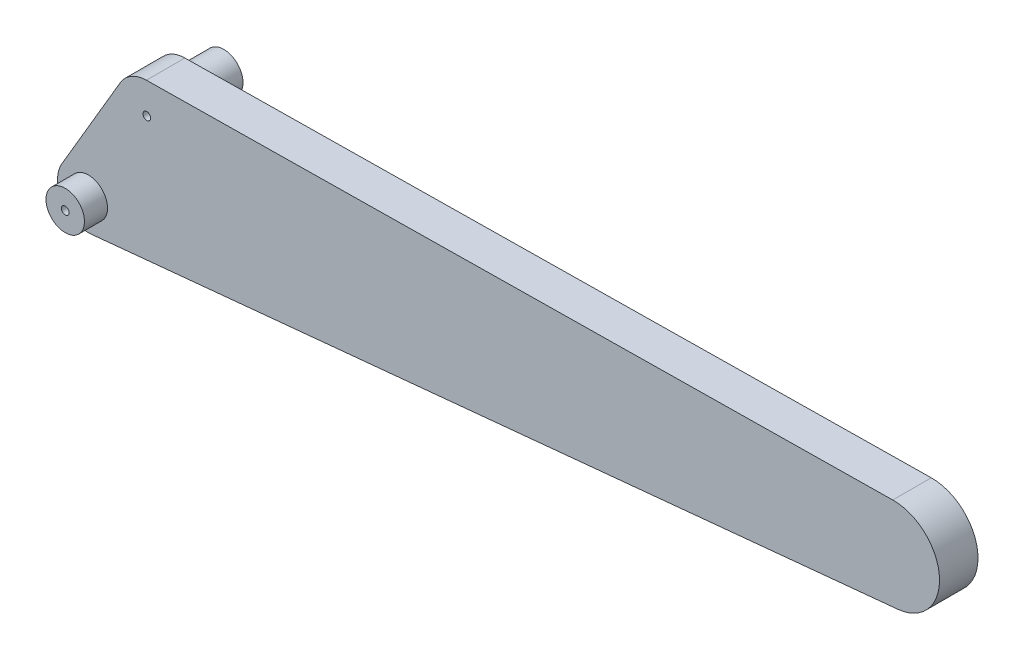
ISO-10303-21;
HEADER;
FILE_DESCRIPTION(('STEP AP214'),'2;1');
FILE_NAME('part.step','',(''),(''),'','','');
FILE_SCHEMA(('AUTOMOTIVE_DESIGN { 1 0 10303 214 1 1 1 1 }'));
ENDSEC;
DATA;
#1=APPLICATION_CONTEXT('core data for automotive mechanical design processes');
#2=APPLICATION_PROTOCOL_DEFINITION('international standard','automotive_design',2000,#1);
#3=PRODUCT_CONTEXT('',#1,'mechanical');
#4=PRODUCT('Part','Part','',(#3));
#5=PRODUCT_RELATED_PRODUCT_CATEGORY('part','',(#4));
#6=PRODUCT_DEFINITION_FORMATION('','',#4);
#7=PRODUCT_DEFINITION_CONTEXT('part definition',#1,'design');
#8=PRODUCT_DEFINITION('design','',#6,#7);
#9=PRODUCT_DEFINITION_SHAPE('','',#8);
#10=(LENGTH_UNIT() NAMED_UNIT(*) SI_UNIT(.MILLI.,.METRE.));
#11=(NAMED_UNIT(*) PLANE_ANGLE_UNIT() SI_UNIT($,.RADIAN.));
#12=(NAMED_UNIT(*) SI_UNIT($,.STERADIAN.) SOLID_ANGLE_UNIT());
#13=UNCERTAINTY_MEASURE_WITH_UNIT(LENGTH_MEASURE(1.E-05),#10,'distance_accuracy_value','');
#14=(GEOMETRIC_REPRESENTATION_CONTEXT(3) GLOBAL_UNCERTAINTY_ASSIGNED_CONTEXT((#13)) GLOBAL_UNIT_ASSIGNED_CONTEXT((#10,
#11,#12)) REPRESENTATION_CONTEXT('',''));
#15=CARTESIAN_POINT('',(0.,0.,0.));
#16=DIRECTION('',(0.,0.,1.));
#17=DIRECTION('',(1.,0.,0.));
#18=AXIS2_PLACEMENT_3D('',#15,#16,#17);
#19=CARTESIAN_POINT('',(0.,0.,5.));
#20=DIRECTION('',(0.,0.,1.));
#21=DIRECTION('',(1.,0.,0.));
#22=AXIS2_PLACEMENT_3D('',#19,#20,#21);
#23=PLANE('',#22);
#24=CARTESIAN_POINT('',(-7.59978648113398,-12.9322560074093,5.));
#25=DIRECTION('',(0.,0.,1.));
#26=DIRECTION('',(1.,0.,0.));
#27=AXIS2_PLACEMENT_3D('',#24,#25,#26);
#28=CIRCLE('',#27,2.5);
#29=CARTESIAN_POINT('',(-5.09978648113398,-12.9322560074093,5.));
#30=VERTEX_POINT('',#29);
#31=EDGE_CURVE('E134',#30,#30,#28,.T.);
#32=ORIENTED_EDGE('',*,*,#31,.F.);
#33=EDGE_LOOP('',(#32));
#34=FACE_BOUND('',#33,.T.);
#35=CARTESIAN_POINT('',(0.,0.,5.));
#36=DIRECTION('',(0.,0.,1.));
#37=DIRECTION('',(1.,0.,0.));
#38=AXIS2_PLACEMENT_3D('',#35,#36,#37);
#39=CIRCLE('',#38,4.);
#40=CARTESIAN_POINT('',(-0.0516811774149059,3.99966611805298,5.));
#41=VERTEX_POINT('',#40);
#42=CARTESIAN_POINT('',(-3.4486016019758,2.02660972830239,5.));
#43=VERTEX_POINT('',#42);
#44=EDGE_CURVE('E146',#41,#43,#39,.T.);
#45=ORIENTED_EDGE('',*,*,#44,.T.);
#46=DIRECTION('',(-0.506652432075599,-0.862150400493951,0.));
#47=VECTOR('',#46,1.);
#48=CARTESIAN_POINT('',(-11.0483880831098,-10.9056462791069,5.));
#49=LINE('',#48,#47);
#50=CARTESIAN_POINT('',(-11.0483880831098,-10.9056462791069,5.));
#51=VERTEX_POINT('',#50);
#52=EDGE_CURVE('E94',#43,#51,#49,.T.);
#53=ORIENTED_EDGE('',*,*,#52,.T.);
#54=CARTESIAN_POINT('',(-7.59978648113398,-12.9322560074093,5.));
#55=DIRECTION('',(0.,0.,1.));
#56=DIRECTION('',(1.,0.,0.));
#57=AXIS2_PLACEMENT_3D('',#54,#55,#56);
#58=CIRCLE('',#57,4.);
#59=CARTESIAN_POINT('',(-7.21247386893879,-16.9134604659161,5.));
#60=VERTEX_POINT('',#59);
#61=EDGE_CURVE('E107',#51,#60,#58,.T.);
#62=ORIENTED_EDGE('',*,*,#61,.T.);
#63=DIRECTION('',(0.995301114626704,0.0968281530487968,0.));
#64=VECTOR('',#63,1.);
#65=CARTESIAN_POINT('',(97.5809689182928,-6.71860047068932,5.));
#66=LINE('',#65,#64);
#67=CARTESIAN_POINT('',(97.5809689182928,-6.71860047068932,5.));
#68=VERTEX_POINT('',#67);
#69=EDGE_CURVE('E101',#60,#68,#66,.T.);
#70=ORIENTED_EDGE('',*,*,#69,.T.);
#71=CARTESIAN_POINT('',(97.,-0.746793782929099,5.));
#72=DIRECTION('',(0.,0.,1.));
#73=DIRECTION('',(1.,0.,0.));
#74=AXIS2_PLACEMENT_3D('',#71,#72,#73);
#75=CIRCLE('',#74,6.);
#76=CARTESIAN_POINT('',(96.9224782338776,5.25270539415037,5.));
#77=VERTEX_POINT('',#76);
#78=EDGE_CURVE('E105',#68,#77,#75,.T.);
#79=ORIENTED_EDGE('',*,*,#78,.T.);
#80=DIRECTION('',(-0.999916529513246,-0.0129202943537264,0.));
#81=VECTOR('',#80,1.);
#82=CARTESIAN_POINT('',(-0.0516811774149059,3.99966611805298,5.));
#83=LINE('',#82,#81);
#84=EDGE_CURVE('E57',#77,#41,#83,.T.);
#85=ORIENTED_EDGE('',*,*,#84,.T.);
#86=EDGE_LOOP('',(#45,#53,#62,#70,#79,#85));
#87=FACE_BOUND('',#86,.T.);
#88=CARTESIAN_POINT('',(0.,0.,5.));
#89=DIRECTION('',(0.,0.,1.));
#90=DIRECTION('',(1.,0.,0.));
#91=AXIS2_PLACEMENT_3D('',#88,#89,#90);
#92=CIRCLE('',#91,0.5);
#93=CARTESIAN_POINT('',(0.5,0.,5.));
#94=VERTEX_POINT('',#93);
#95=EDGE_CURVE('E222',#94,#94,#92,.T.);
#96=ORIENTED_EDGE('',*,*,#95,.F.);
#97=EDGE_LOOP('',(#96));
#98=FACE_BOUND('',#97,.T.);
#99=ADVANCED_FACE('F39',(#34,#87,#98),#23,.T.);
#100=CARTESIAN_POINT('',(0.,0.,0.));
#101=DIRECTION('',(0.,0.,1.));
#102=DIRECTION('',(1.,0.,0.));
#103=AXIS2_PLACEMENT_3D('',#100,#101,#102);
#104=PLANE('',#103);
#105=CARTESIAN_POINT('',(0.,0.,0.));
#106=DIRECTION('',(0.,0.,1.));
#107=DIRECTION('',(1.,0.,0.));
#108=AXIS2_PLACEMENT_3D('',#105,#106,#107);
#109=CIRCLE('',#108,4.);
#110=CARTESIAN_POINT('',(-0.0516811774149059,3.99966611805298,0.));
#111=VERTEX_POINT('',#110);
#112=CARTESIAN_POINT('',(-3.4486016019758,2.02660972830239,0.));
#113=VERTEX_POINT('',#112);
#114=EDGE_CURVE('E129',#111,#113,#109,.T.);
#115=ORIENTED_EDGE('',*,*,#114,.F.);
#116=DIRECTION('',(-0.999916529513246,-0.0129202943537264,0.));
#117=VECTOR('',#116,1.);
#118=CARTESIAN_POINT('',(-0.0516811774149059,3.99966611805298,0.));
#119=LINE('',#118,#117);
#120=CARTESIAN_POINT('',(96.9224782338776,5.25270539415037,0.));
#121=VERTEX_POINT('',#120);
#122=EDGE_CURVE('E86',#121,#111,#119,.T.);
#123=ORIENTED_EDGE('',*,*,#122,.F.);
#124=CARTESIAN_POINT('',(97.,-0.746793782929099,0.));
#125=DIRECTION('',(0.,0.,1.));
#126=DIRECTION('',(1.,0.,0.));
#127=AXIS2_PLACEMENT_3D('',#124,#125,#126);
#128=CIRCLE('',#127,6.);
#129=CARTESIAN_POINT('',(97.5809689182928,-6.71860047068932,0.));
#130=VERTEX_POINT('',#129);
#131=EDGE_CURVE('E80',#130,#121,#128,.T.);
#132=ORIENTED_EDGE('',*,*,#131,.F.);
#133=DIRECTION('',(0.995301114626704,0.0968281530487968,0.));
#134=VECTOR('',#133,1.);
#135=CARTESIAN_POINT('',(97.5809689182928,-6.71860047068932,0.));
#136=LINE('',#135,#134);
#137=CARTESIAN_POINT('',(-7.21247386893879,-16.9134604659161,0.));
#138=VERTEX_POINT('',#137);
#139=EDGE_CURVE('E116',#138,#130,#136,.T.);
#140=ORIENTED_EDGE('',*,*,#139,.F.);
#141=CARTESIAN_POINT('',(-7.59978648113398,-12.9322560074093,0.));
#142=DIRECTION('',(0.,0.,1.));
#143=DIRECTION('',(1.,0.,0.));
#144=AXIS2_PLACEMENT_3D('',#141,#142,#143);
#145=CIRCLE('',#144,4.);
#146=CARTESIAN_POINT('',(-11.0483880831098,-10.9056462791069,0.));
#147=VERTEX_POINT('',#146);
#148=EDGE_CURVE('E137',#147,#138,#145,.T.);
#149=ORIENTED_EDGE('',*,*,#148,.F.);
#150=DIRECTION('',(-0.506652432075599,-0.862150400493951,0.));
#151=VECTOR('',#150,1.);
#152=CARTESIAN_POINT('',(-11.0483880831098,-10.9056462791069,0.));
#153=LINE('',#152,#151);
#154=EDGE_CURVE('E133',#113,#147,#153,.T.);
#155=ORIENTED_EDGE('',*,*,#154,.F.);
#156=EDGE_LOOP('',(#115,#123,#132,#140,#149,#155));
#157=FACE_BOUND('',#156,.T.);
#158=CARTESIAN_POINT('',(0.,0.,0.));
#159=DIRECTION('',(0.,0.,1.));
#160=DIRECTION('',(1.,0.,0.));
#161=AXIS2_PLACEMENT_3D('',#158,#159,#160);
#162=CIRCLE('',#161,2.5);
#163=CARTESIAN_POINT('',(2.5,0.,0.));
#164=VERTEX_POINT('',#163);
#165=EDGE_CURVE('E234',#164,#164,#162,.T.);
#166=ORIENTED_EDGE('',*,*,#165,.T.);
#167=EDGE_LOOP('',(#166));
#168=FACE_BOUND('',#167,.T.);
#169=CARTESIAN_POINT('',(-7.59978648113398,-12.9322560074093,0.));
#170=DIRECTION('',(0.,0.,-1.));
#171=DIRECTION('',(-1.,0.,0.));
#172=AXIS2_PLACEMENT_3D('',#169,#170,#171);
#173=CIRCLE('',#172,0.500000000000001);
#174=CARTESIAN_POINT('',(-8.09978648113398,-12.9322560074093,0.));
#175=VERTEX_POINT('',#174);
#176=EDGE_CURVE('E211',#175,#175,#173,.T.);
#177=ORIENTED_EDGE('',*,*,#176,.F.);
#178=EDGE_LOOP('',(#177));
#179=FACE_BOUND('',#178,.T.);
#180=ADVANCED_FACE('F159',(#157,#168,#179),#104,.F.);
#181=CARTESIAN_POINT('',(0.,0.,5.));
#182=DIRECTION('',(0.,0.,-1.));
#183=DIRECTION('',(-1.,0.,0.));
#184=AXIS2_PLACEMENT_3D('',#181,#182,#183);
#185=CYLINDRICAL_SURFACE('',#184,4.);
#186=ORIENTED_EDGE('',*,*,#114,.T.);
#187=DIRECTION('',(0.,0.,-1.));
#188=VECTOR('',#187,1.);
#189=CARTESIAN_POINT('',(-3.4486016019758,2.02660972830239,5.));
#190=LINE('',#189,#188);
#191=EDGE_CURVE('E11',#43,#113,#190,.T.);
#192=ORIENTED_EDGE('',*,*,#191,.F.);
#193=ORIENTED_EDGE('',*,*,#44,.F.);
#194=DIRECTION('',(0.,0.,-1.));
#195=VECTOR('',#194,1.);
#196=CARTESIAN_POINT('',(-0.0516811774149059,3.99966611805298,5.));
#197=LINE('',#196,#195);
#198=EDGE_CURVE('E125',#41,#111,#197,.T.);
#199=ORIENTED_EDGE('',*,*,#198,.T.);
#200=EDGE_LOOP('',(#186,#192,#193,#199));
#201=FACE_BOUND('',#200,.T.);
#202=ADVANCED_FACE('F41',(#201),#185,.T.);
#203=CARTESIAN_POINT('',(-11.0483880831098,-10.9056462791069,5.));
#204=DIRECTION('',(0.862150400493951,-0.506652432075599,0.));
#205=DIRECTION('',(0.506652432075599,0.862150400493952,0.));
#206=AXIS2_PLACEMENT_3D('',#203,#204,#205);
#207=PLANE('',#206);
#208=ORIENTED_EDGE('',*,*,#154,.T.);
#209=DIRECTION('',(0.,0.,-1.));
#210=VECTOR('',#209,1.);
#211=CARTESIAN_POINT('',(-11.0483880831098,-10.9056462791069,5.));
#212=LINE('',#211,#210);
#213=EDGE_CURVE('E49',#51,#147,#212,.T.);
#214=ORIENTED_EDGE('',*,*,#213,.F.);
#215=ORIENTED_EDGE('',*,*,#52,.F.);
#216=ORIENTED_EDGE('',*,*,#191,.T.);
#217=EDGE_LOOP('',(#208,#214,#215,#216));
#218=FACE_BOUND('',#217,.T.);
#219=ADVANCED_FACE('F308',(#218),#207,.F.);
#220=CARTESIAN_POINT('',(-7.59978648113398,-12.9322560074093,5.));
#221=DIRECTION('',(0.,0.,-1.));
#222=DIRECTION('',(-1.,0.,0.));
#223=AXIS2_PLACEMENT_3D('',#220,#221,#222);
#224=CYLINDRICAL_SURFACE('',#223,4.);
#225=ORIENTED_EDGE('',*,*,#148,.T.);
#226=DIRECTION('',(0.,0.,-1.));
#227=VECTOR('',#226,1.);
#228=CARTESIAN_POINT('',(-7.21247386893879,-16.9134604659161,5.));
#229=LINE('',#228,#227);
#230=EDGE_CURVE('E118',#60,#138,#229,.T.);
#231=ORIENTED_EDGE('',*,*,#230,.F.);
#232=ORIENTED_EDGE('',*,*,#61,.F.);
#233=ORIENTED_EDGE('',*,*,#213,.T.);
#234=EDGE_LOOP('',(#225,#231,#232,#233));
#235=FACE_BOUND('',#234,.T.);
#236=ADVANCED_FACE('F156',(#235),#224,.T.);
#237=CARTESIAN_POINT('',(97.5809689182928,-6.71860047068932,5.));
#238=DIRECTION('',(-0.0968281530487968,0.995301114626704,0.));
#239=DIRECTION('',(-0.995301114626704,-0.0968281530487968,0.));
#240=AXIS2_PLACEMENT_3D('',#237,#238,#239);
#241=PLANE('',#240);
#242=ORIENTED_EDGE('',*,*,#139,.T.);
#243=DIRECTION('',(0.,0.,-1.));
#244=VECTOR('',#243,1.);
#245=CARTESIAN_POINT('',(97.5809689182928,-6.71860047068932,5.));
#246=LINE('',#245,#244);
#247=EDGE_CURVE('E113',#68,#130,#246,.T.);
#248=ORIENTED_EDGE('',*,*,#247,.F.);
#249=ORIENTED_EDGE('',*,*,#69,.F.);
#250=ORIENTED_EDGE('',*,*,#230,.T.);
#251=EDGE_LOOP('',(#242,#248,#249,#250));
#252=FACE_BOUND('',#251,.T.);
#253=ADVANCED_FACE('F114',(#252),#241,.F.);
#254=CARTESIAN_POINT('',(97.,-0.746793782929099,5.));
#255=DIRECTION('',(0.,0.,-1.));
#256=DIRECTION('',(-1.,0.,0.));
#257=AXIS2_PLACEMENT_3D('',#254,#255,#256);
#258=CYLINDRICAL_SURFACE('',#257,6.);
#259=ORIENTED_EDGE('',*,*,#131,.T.);
#260=DIRECTION('',(0.,0.,-1.));
#261=VECTOR('',#260,1.);
#262=CARTESIAN_POINT('',(96.9224782338776,5.25270539415037,5.));
#263=LINE('',#262,#261);
#264=EDGE_CURVE('E119',#77,#121,#263,.T.);
#265=ORIENTED_EDGE('',*,*,#264,.F.);
#266=ORIENTED_EDGE('',*,*,#78,.F.);
#267=ORIENTED_EDGE('',*,*,#247,.T.);
#268=EDGE_LOOP('',(#259,#265,#266,#267));
#269=FACE_BOUND('',#268,.T.);
#270=ADVANCED_FACE('F121',(#269),#258,.T.);
#271=CARTESIAN_POINT('',(-0.0516811774149059,3.99966611805298,5.));
#272=DIRECTION('',(0.0129202943537264,-0.999916529513245,0.));
#273=DIRECTION('',(0.999916529513246,0.0129202943537264,0.));
#274=AXIS2_PLACEMENT_3D('',#271,#272,#273);
#275=PLANE('',#274);
#276=ORIENTED_EDGE('',*,*,#122,.T.);
#277=ORIENTED_EDGE('',*,*,#198,.F.);
#278=ORIENTED_EDGE('',*,*,#84,.F.);
#279=ORIENTED_EDGE('',*,*,#264,.T.);
#280=EDGE_LOOP('',(#276,#277,#278,#279));
#281=FACE_BOUND('',#280,.T.);
#282=ADVANCED_FACE('F164',(#281),#275,.F.);
#283=CARTESIAN_POINT('',(0.,0.,-5.));
#284=DIRECTION('',(0.,0.,1.));
#285=DIRECTION('',(1.,0.,0.));
#286=AXIS2_PLACEMENT_3D('',#283,#284,#285);
#287=CYLINDRICAL_SURFACE('',#286,2.5);
#288=CARTESIAN_POINT('',(0.,0.,-5.));
#289=DIRECTION('',(0.,0.,1.));
#290=DIRECTION('',(1.,0.,0.));
#291=AXIS2_PLACEMENT_3D('',#288,#289,#290);
#292=CIRCLE('',#291,2.5);
#293=CARTESIAN_POINT('',(2.5,0.,-5.));
#294=VERTEX_POINT('',#293);
#295=EDGE_CURVE('E227',#294,#294,#292,.T.);
#296=ORIENTED_EDGE('',*,*,#295,.T.);
#297=EDGE_LOOP('',(#296));
#298=FACE_BOUND('',#297,.T.);
#299=ORIENTED_EDGE('',*,*,#165,.F.);
#300=EDGE_LOOP('',(#299));
#301=FACE_BOUND('',#300,.T.);
#302=ADVANCED_FACE('F166',(#298,#301),#287,.T.);
#303=CARTESIAN_POINT('',(0.,0.,-5.));
#304=DIRECTION('',(0.,0.,1.));
#305=DIRECTION('',(1.,0.,0.));
#306=AXIS2_PLACEMENT_3D('',#303,#304,#305);
#307=PLANE('',#306);
#308=CARTESIAN_POINT('',(0.,0.,-5.));
#309=DIRECTION('',(0.,0.,1.));
#310=DIRECTION('',(1.,0.,0.));
#311=AXIS2_PLACEMENT_3D('',#308,#309,#310);
#312=CIRCLE('',#311,0.5);
#313=CARTESIAN_POINT('',(0.5,0.,-5.));
#314=VERTEX_POINT('',#313);
#315=EDGE_CURVE('E223',#314,#314,#312,.T.);
#316=ORIENTED_EDGE('',*,*,#315,.T.);
#317=EDGE_LOOP('',(#316));
#318=FACE_BOUND('',#317,.T.);
#319=ORIENTED_EDGE('',*,*,#295,.F.);
#320=EDGE_LOOP('',(#319));
#321=FACE_BOUND('',#320,.T.);
#322=ADVANCED_FACE('F172',(#318,#321),#307,.F.);
#323=CARTESIAN_POINT('',(0.,0.,-5.));
#324=DIRECTION('',(0.,0.,1.));
#325=DIRECTION('',(1.,0.,0.));
#326=AXIS2_PLACEMENT_3D('',#323,#324,#325);
#327=CYLINDRICAL_SURFACE('',#326,0.5);
#328=ORIENTED_EDGE('',*,*,#315,.F.);
#329=EDGE_LOOP('',(#328));
#330=FACE_BOUND('',#329,.T.);
#331=ORIENTED_EDGE('',*,*,#95,.T.);
#332=EDGE_LOOP('',(#331));
#333=FACE_BOUND('',#332,.T.);
#334=ADVANCED_FACE('F187',(#330,#333),#327,.F.);
#335=CARTESIAN_POINT('',(-7.59978648113398,-12.9322560074093,8.));
#336=DIRECTION('',(0.,0.,-1.));
#337=DIRECTION('',(-1.,0.,0.));
#338=AXIS2_PLACEMENT_3D('',#335,#336,#337);
#339=CYLINDRICAL_SURFACE('',#338,2.5);
#340=ORIENTED_EDGE('',*,*,#31,.T.);
#341=EDGE_LOOP('',(#340));
#342=FACE_BOUND('',#341,.T.);
#343=CARTESIAN_POINT('',(-7.59978648113398,-12.9322560074093,8.));
#344=DIRECTION('',(0.,0.,-1.));
#345=DIRECTION('',(-1.,0.,0.));
#346=AXIS2_PLACEMENT_3D('',#343,#344,#345);
#347=CIRCLE('',#346,2.5);
#348=CARTESIAN_POINT('',(-10.099786481134,-12.9322560074093,8.));
#349=VERTEX_POINT('',#348);
#350=EDGE_CURVE('E216',#349,#349,#347,.T.);
#351=ORIENTED_EDGE('',*,*,#350,.T.);
#352=EDGE_LOOP('',(#351));
#353=FACE_BOUND('',#352,.T.);
#354=ADVANCED_FACE('F191',(#342,#353),#339,.T.);
#355=CARTESIAN_POINT('',(-7.59978648113398,-12.9322560074093,8.));
#356=DIRECTION('',(0.,0.,-1.));
#357=DIRECTION('',(-1.,0.,0.));
#358=AXIS2_PLACEMENT_3D('',#355,#356,#357);
#359=PLANE('',#358);
#360=CARTESIAN_POINT('',(-7.59978648113398,-12.9322560074093,8.));
#361=DIRECTION('',(0.,0.,-1.));
#362=DIRECTION('',(-1.,0.,0.));
#363=AXIS2_PLACEMENT_3D('',#360,#361,#362);
#364=CIRCLE('',#363,0.500000000000001);
#365=CARTESIAN_POINT('',(-8.09978648113398,-12.9322560074093,8.));
#366=VERTEX_POINT('',#365);
#367=EDGE_CURVE('E208',#366,#366,#364,.T.);
#368=ORIENTED_EDGE('',*,*,#367,.T.);
#369=EDGE_LOOP('',(#368));
#370=FACE_BOUND('',#369,.T.);
#371=ORIENTED_EDGE('',*,*,#350,.F.);
#372=EDGE_LOOP('',(#371));
#373=FACE_BOUND('',#372,.T.);
#374=ADVANCED_FACE('F195',(#370,#373),#359,.F.);
#375=CARTESIAN_POINT('',(-7.59978648113398,-12.9322560074093,8.));
#376=DIRECTION('',(0.,0.,-1.));
#377=DIRECTION('',(-1.,0.,0.));
#378=AXIS2_PLACEMENT_3D('',#375,#376,#377);
#379=CYLINDRICAL_SURFACE('',#378,0.500000000000001);
#380=ORIENTED_EDGE('',*,*,#367,.F.);
#381=EDGE_LOOP('',(#380));
#382=FACE_BOUND('',#381,.T.);
#383=ORIENTED_EDGE('',*,*,#176,.T.);
#384=EDGE_LOOP('',(#383));
#385=FACE_BOUND('',#384,.T.);
#386=ADVANCED_FACE('F199',(#382,#385),#379,.F.);
#387=CLOSED_SHELL('',(#99,#180,#202,#219,#236,#253,#270,#282,#302,#322,#334,#354,#374,#386));
#388=MANIFOLD_SOLID_BREP('B2',#387);
#389=ADVANCED_BREP_SHAPE_REPRESENTATION('',(#18,#388),#14);
#390=SHAPE_DEFINITION_REPRESENTATION(#9,#389);
ENDSEC;
END-ISO-10303-21;
